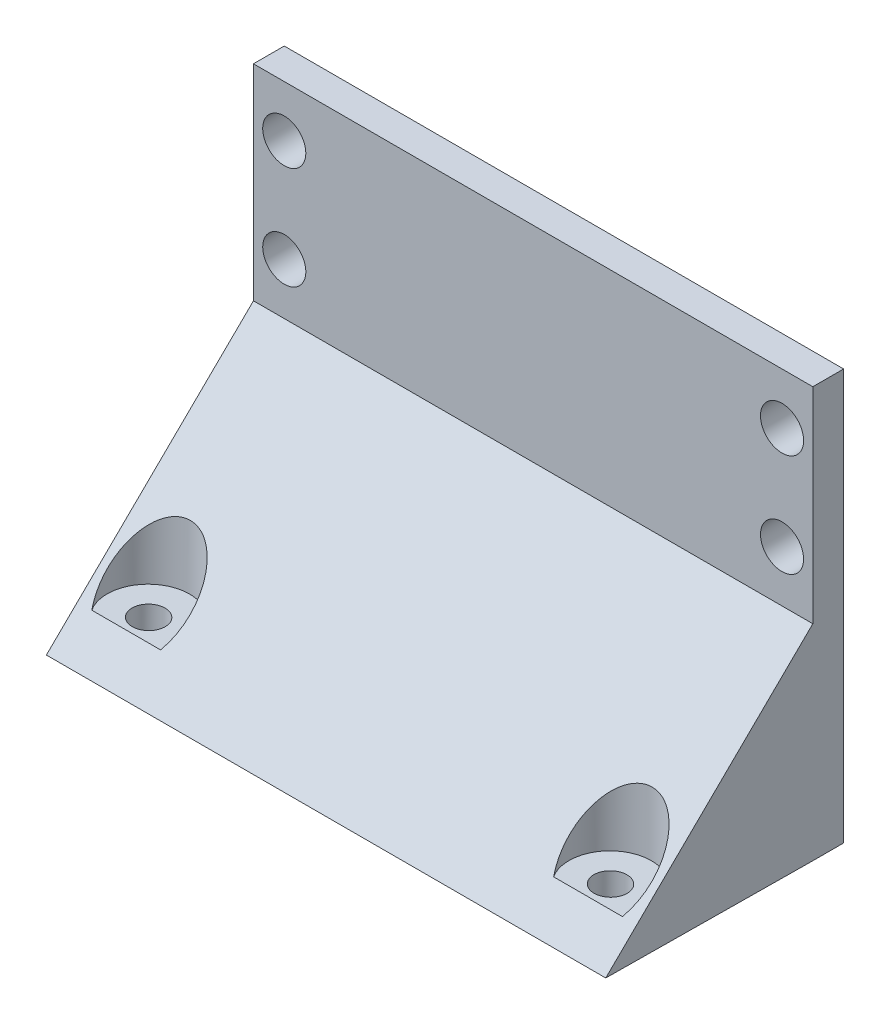
ISO-10303-21;
HEADER;
FILE_DESCRIPTION(('STEP AP214'),'2;1');
FILE_NAME('part.step','',(''),(''),'','','');
FILE_SCHEMA(('AUTOMOTIVE_DESIGN { 1 0 10303 214 1 1 1 1 }'));
ENDSEC;
DATA;
#1=APPLICATION_CONTEXT('core data for automotive mechanical design processes');
#2=APPLICATION_PROTOCOL_DEFINITION('international standard','automotive_design',2000,#1);
#3=PRODUCT_CONTEXT('',#1,'mechanical');
#4=PRODUCT('Part','Part','',(#3));
#5=PRODUCT_RELATED_PRODUCT_CATEGORY('part','',(#4));
#6=PRODUCT_DEFINITION_FORMATION('','',#4);
#7=PRODUCT_DEFINITION_CONTEXT('part definition',#1,'design');
#8=PRODUCT_DEFINITION('design','',#6,#7);
#9=PRODUCT_DEFINITION_SHAPE('','',#8);
#10=(LENGTH_UNIT() NAMED_UNIT(*) SI_UNIT(.MILLI.,.METRE.));
#11=(NAMED_UNIT(*) PLANE_ANGLE_UNIT() SI_UNIT($,.RADIAN.));
#12=(NAMED_UNIT(*) SI_UNIT($,.STERADIAN.) SOLID_ANGLE_UNIT());
#13=UNCERTAINTY_MEASURE_WITH_UNIT(LENGTH_MEASURE(1.E-05),#10,'distance_accuracy_value','');
#14=(GEOMETRIC_REPRESENTATION_CONTEXT(3) GLOBAL_UNCERTAINTY_ASSIGNED_CONTEXT((#13)) GLOBAL_UNIT_ASSIGNED_CONTEXT((#10,
#11,#12)) REPRESENTATION_CONTEXT('',''));
#15=CARTESIAN_POINT('',(0.,0.,0.));
#16=DIRECTION('',(0.,0.,1.));
#17=DIRECTION('',(1.,0.,0.));
#18=AXIS2_PLACEMENT_3D('',#15,#16,#17);
#19=CARTESIAN_POINT('',(55.6592353913338,-20.,3.));
#20=DIRECTION('',(0.,0.713679885564079,0.700471998684632));
#21=DIRECTION('',(0.,-0.700471998684632,0.713679885564079));
#22=AXIS2_PLACEMENT_3D('',#19,#20,#21);
#23=PLANE('',#22);
#24=DIRECTION('',(1.,0.,0.));
#25=VECTOR('',#24,1.);
#26=CARTESIAN_POINT('',(55.6592353913338,-36.8323579858021,20.1497438065177));
#27=LINE('',#26,#25);
#28=CARTESIAN_POINT('',(19.1504595631983,-36.8323579858021,20.1497438065177));
#29=VERTEX_POINT('',#28);
#30=CARTESIAN_POINT('',(25.8495404368017,-36.8323579858021,20.1497438065177));
#31=VERTEX_POINT('',#30);
#32=EDGE_CURVE('E121',#29,#31,#27,.T.);
#33=ORIENTED_EDGE('',*,*,#32,.F.);
#34=CARTESIAN_POINT('',(22.5,-34.6654945078744,17.9420226101467));
#35=DIRECTION('',(0.,0.713679885564079,0.700471998684632));
#36=DIRECTION('',(0.,0.700471998684632,-0.713679885564079));
#37=AXIS2_PLACEMENT_3D('',#34,#35,#36);
#38=ELLIPSE('',#37,5.65927135746234,4.);
#39=EDGE_CURVE('E54',#29,#31,#38,.F.);
#40=ORIENTED_EDGE('',*,*,#39,.T.);
#41=EDGE_LOOP('',(#33,#40));
#42=FACE_BOUND('',#41,.T.);
#43=DIRECTION('',(0.,-0.700471998684632,0.713679885564079));
#44=VECTOR('',#43,1.);
#45=CARTESIAN_POINT('',(27.25,-20.,3.));
#46=LINE('',#45,#44);
#47=CARTESIAN_POINT('',(27.25,-20.,3.));
#48=VERTEX_POINT('',#47);
#49=CARTESIAN_POINT('',(27.25,-39.8029407759475,23.1763390019155));
#50=VERTEX_POINT('',#49);
#51=EDGE_CURVE('E224',#48,#50,#46,.T.);
#52=ORIENTED_EDGE('',*,*,#51,.F.);
#53=DIRECTION('',(-1.,0.,0.));
#54=VECTOR('',#53,1.);
#55=CARTESIAN_POINT('',(55.6592353913338,-20.,3.));
#56=LINE('',#55,#54);
#57=CARTESIAN_POINT('',(-27.25,-20.,3.));
#58=VERTEX_POINT('',#57);
#59=EDGE_CURVE('E228',#48,#58,#56,.T.);
#60=ORIENTED_EDGE('',*,*,#59,.T.);
#61=DIRECTION('',(0.,0.700471998684632,-0.713679885564079));
#62=VECTOR('',#61,1.);
#63=CARTESIAN_POINT('',(-27.25,-20.,3.));
#64=LINE('',#63,#62);
#65=CARTESIAN_POINT('',(-27.25,-39.8029407759475,23.1763390019155));
#66=VERTEX_POINT('',#65);
#67=EDGE_CURVE('E229',#66,#58,#64,.T.);
#68=ORIENTED_EDGE('',*,*,#67,.F.);
#69=DIRECTION('',(-1.,0.,0.));
#70=VECTOR('',#69,1.);
#71=CARTESIAN_POINT('',(55.6592353913338,-39.8029407759475,23.1763390019155));
#72=LINE('',#71,#70);
#73=EDGE_CURVE('E225',#50,#66,#72,.T.);
#74=ORIENTED_EDGE('',*,*,#73,.F.);
#75=EDGE_LOOP('',(#52,#60,#68,#74));
#76=FACE_BOUND('',#75,.T.);
#77=DIRECTION('',(1.,0.,0.));
#78=VECTOR('',#77,1.);
#79=CARTESIAN_POINT('',(55.6592353913338,-36.8323579858021,20.1497438065177));
#80=LINE('',#79,#78);
#81=CARTESIAN_POINT('',(-25.8495404368017,-36.8323579858021,20.1497438065177));
#82=VERTEX_POINT('',#81);
#83=CARTESIAN_POINT('',(-19.1504595631983,-36.8323579858021,20.1497438065177));
#84=VERTEX_POINT('',#83);
#85=EDGE_CURVE('E145',#82,#84,#80,.T.);
#86=ORIENTED_EDGE('',*,*,#85,.F.);
#87=CARTESIAN_POINT('',(-22.5,-34.6654945078744,17.9420226101467));
#88=DIRECTION('',(0.,0.713679885564079,0.700471998684632));
#89=DIRECTION('',(0.,0.700471998684632,-0.713679885564079));
#90=AXIS2_PLACEMENT_3D('',#87,#88,#89);
#91=ELLIPSE('',#90,5.65927135746234,4.);
#92=EDGE_CURVE('E11',#82,#84,#91,.F.);
#93=ORIENTED_EDGE('',*,*,#92,.T.);
#94=EDGE_LOOP('',(#86,#93));
#95=FACE_BOUND('',#94,.T.);
#96=ADVANCED_FACE('F45',(#42,#76,#95),#23,.T.);
#97=CARTESIAN_POINT('',(0.,0.,3.));
#98=DIRECTION('',(0.,0.,1.));
#99=DIRECTION('',(1.,0.,0.));
#100=AXIS2_PLACEMENT_3D('',#97,#98,#99);
#101=PLANE('',#100);
#102=ORIENTED_EDGE('',*,*,#59,.F.);
#103=DIRECTION('',(0.,1.,0.));
#104=VECTOR('',#103,1.);
#105=CARTESIAN_POINT('',(27.25,0.,3.));
#106=LINE('',#105,#104);
#107=CARTESIAN_POINT('',(27.25,0.,3.));
#108=VERTEX_POINT('',#107);
#109=EDGE_CURVE('E164',#48,#108,#106,.T.);
#110=ORIENTED_EDGE('',*,*,#109,.T.);
#111=DIRECTION('',(-1.,0.,0.));
#112=VECTOR('',#111,1.);
#113=CARTESIAN_POINT('',(-27.25,0.,3.));
#114=LINE('',#113,#112);
#115=CARTESIAN_POINT('',(-27.25,0.,3.));
#116=VERTEX_POINT('',#115);
#117=EDGE_CURVE('E184',#108,#116,#114,.T.);
#118=ORIENTED_EDGE('',*,*,#117,.T.);
#119=DIRECTION('',(0.,-1.,0.));
#120=VECTOR('',#119,1.);
#121=CARTESIAN_POINT('',(-27.25,0.,3.));
#122=LINE('',#121,#120);
#123=EDGE_CURVE('E181',#116,#58,#122,.T.);
#124=ORIENTED_EDGE('',*,*,#123,.T.);
#125=EDGE_LOOP('',(#102,#110,#118,#124));
#126=FACE_BOUND('',#125,.T.);
#127=CARTESIAN_POINT('',(24.25,-15.,3.));
#128=DIRECTION('',(0.,0.,1.));
#129=DIRECTION('',(1.,0.,0.));
#130=AXIS2_PLACEMENT_3D('',#127,#128,#129);
#131=CIRCLE('',#130,2.1);
#132=CARTESIAN_POINT('',(26.35,-15.,3.));
#133=VERTEX_POINT('',#132);
#134=EDGE_CURVE('E201',#133,#133,#131,.T.);
#135=ORIENTED_EDGE('',*,*,#134,.F.);
#136=EDGE_LOOP('',(#135));
#137=FACE_BOUND('',#136,.T.);
#138=CARTESIAN_POINT('',(-24.25,-5.,3.));
#139=DIRECTION('',(0.,0.,1.));
#140=DIRECTION('',(1.,0.,0.));
#141=AXIS2_PLACEMENT_3D('',#138,#139,#140);
#142=CIRCLE('',#141,2.1);
#143=CARTESIAN_POINT('',(-22.15,-5.,3.));
#144=VERTEX_POINT('',#143);
#145=EDGE_CURVE('E175',#144,#144,#142,.T.);
#146=ORIENTED_EDGE('',*,*,#145,.F.);
#147=EDGE_LOOP('',(#146));
#148=FACE_BOUND('',#147,.T.);
#149=CARTESIAN_POINT('',(24.25,-4.99999999999999,3.));
#150=DIRECTION('',(0.,0.,1.));
#151=DIRECTION('',(-1.,0.,0.));
#152=AXIS2_PLACEMENT_3D('',#149,#150,#151);
#153=CIRCLE('',#152,2.1);
#154=CARTESIAN_POINT('',(22.15,-4.99999999999999,3.));
#155=VERTEX_POINT('',#154);
#156=EDGE_CURVE('E193',#155,#155,#153,.T.);
#157=ORIENTED_EDGE('',*,*,#156,.F.);
#158=EDGE_LOOP('',(#157));
#159=FACE_BOUND('',#158,.T.);
#160=CARTESIAN_POINT('',(-24.25,-15.,3.));
#161=DIRECTION('',(0.,0.,1.));
#162=DIRECTION('',(-1.,0.,0.));
#163=AXIS2_PLACEMENT_3D('',#160,#161,#162);
#164=CIRCLE('',#163,2.1);
#165=CARTESIAN_POINT('',(-26.35,-15.,3.));
#166=VERTEX_POINT('',#165);
#167=EDGE_CURVE('E209',#166,#166,#164,.T.);
#168=ORIENTED_EDGE('',*,*,#167,.F.);
#169=EDGE_LOOP('',(#168));
#170=FACE_BOUND('',#169,.T.);
#171=ADVANCED_FACE('F313',(#126,#137,#148,#159,#170),#101,.T.);
#172=CARTESIAN_POINT('',(0.,0.,0.));
#173=DIRECTION('',(0.,0.,1.));
#174=DIRECTION('',(1.,0.,0.));
#175=AXIS2_PLACEMENT_3D('',#172,#173,#174);
#176=PLANE('',#175);
#177=DIRECTION('',(0.,1.,0.));
#178=VECTOR('',#177,1.);
#179=CARTESIAN_POINT('',(27.25,0.,0.));
#180=LINE('',#179,#178);
#181=CARTESIAN_POINT('',(27.25,-40.,0.));
#182=VERTEX_POINT('',#181);
#183=CARTESIAN_POINT('',(27.25,0.,0.));
#184=VERTEX_POINT('',#183);
#185=EDGE_CURVE('E171',#182,#184,#180,.T.);
#186=ORIENTED_EDGE('',*,*,#185,.F.);
#187=DIRECTION('',(1.,0.,0.));
#188=VECTOR('',#187,1.);
#189=CARTESIAN_POINT('',(-27.25,-40.,0.));
#190=LINE('',#189,#188);
#191=CARTESIAN_POINT('',(-27.25,-40.,0.));
#192=VERTEX_POINT('',#191);
#193=EDGE_CURVE('E161',#192,#182,#190,.T.);
#194=ORIENTED_EDGE('',*,*,#193,.F.);
#195=DIRECTION('',(0.,-1.,0.));
#196=VECTOR('',#195,1.);
#197=CARTESIAN_POINT('',(-27.25,0.,0.));
#198=LINE('',#197,#196);
#199=CARTESIAN_POINT('',(-27.25,0.,0.));
#200=VERTEX_POINT('',#199);
#201=EDGE_CURVE('E165',#200,#192,#198,.T.);
#202=ORIENTED_EDGE('',*,*,#201,.F.);
#203=DIRECTION('',(-1.,0.,0.));
#204=VECTOR('',#203,1.);
#205=CARTESIAN_POINT('',(-27.25,0.,0.));
#206=LINE('',#205,#204);
#207=EDGE_CURVE('E168',#184,#200,#206,.T.);
#208=ORIENTED_EDGE('',*,*,#207,.F.);
#209=EDGE_LOOP('',(#186,#194,#202,#208));
#210=FACE_BOUND('',#209,.T.);
#211=CARTESIAN_POINT('',(-24.25,-5.,0.));
#212=DIRECTION('',(0.,0.,1.));
#213=DIRECTION('',(1.,0.,0.));
#214=AXIS2_PLACEMENT_3D('',#211,#212,#213);
#215=CIRCLE('',#214,2.1);
#216=CARTESIAN_POINT('',(-22.15,-5.,0.));
#217=VERTEX_POINT('',#216);
#218=EDGE_CURVE('E189',#217,#217,#215,.T.);
#219=ORIENTED_EDGE('',*,*,#218,.T.);
#220=EDGE_LOOP('',(#219));
#221=FACE_BOUND('',#220,.T.);
#222=CARTESIAN_POINT('',(24.25,-4.99999999999999,0.));
#223=DIRECTION('',(0.,0.,1.));
#224=DIRECTION('',(-1.,0.,0.));
#225=AXIS2_PLACEMENT_3D('',#222,#223,#224);
#226=CIRCLE('',#225,2.1);
#227=CARTESIAN_POINT('',(22.15,-4.99999999999999,0.));
#228=VERTEX_POINT('',#227);
#229=EDGE_CURVE('E197',#228,#228,#226,.T.);
#230=ORIENTED_EDGE('',*,*,#229,.T.);
#231=EDGE_LOOP('',(#230));
#232=FACE_BOUND('',#231,.T.);
#233=CARTESIAN_POINT('',(24.25,-15.,0.));
#234=DIRECTION('',(0.,0.,1.));
#235=DIRECTION('',(1.,0.,0.));
#236=AXIS2_PLACEMENT_3D('',#233,#234,#235);
#237=CIRCLE('',#236,2.1);
#238=CARTESIAN_POINT('',(26.35,-15.,0.));
#239=VERTEX_POINT('',#238);
#240=EDGE_CURVE('E205',#239,#239,#237,.T.);
#241=ORIENTED_EDGE('',*,*,#240,.T.);
#242=EDGE_LOOP('',(#241));
#243=FACE_BOUND('',#242,.T.);
#244=CARTESIAN_POINT('',(-24.25,-15.,0.));
#245=DIRECTION('',(0.,0.,1.));
#246=DIRECTION('',(-1.,0.,0.));
#247=AXIS2_PLACEMENT_3D('',#244,#245,#246);
#248=CIRCLE('',#247,2.1);
#249=CARTESIAN_POINT('',(-26.35,-15.,0.));
#250=VERTEX_POINT('',#249);
#251=EDGE_CURVE('E213',#250,#250,#248,.T.);
#252=ORIENTED_EDGE('',*,*,#251,.T.);
#253=EDGE_LOOP('',(#252));
#254=FACE_BOUND('',#253,.T.);
#255=ADVANCED_FACE('F318',(#210,#221,#232,#243,#254),#176,.F.);
#256=CARTESIAN_POINT('',(27.25,0.,3.));
#257=DIRECTION('',(-1.,0.,0.));
#258=DIRECTION('',(0.,-1.,0.));
#259=AXIS2_PLACEMENT_3D('',#256,#257,#258);
#260=PLANE('',#259);
#261=ORIENTED_EDGE('',*,*,#185,.T.);
#262=DIRECTION('',(0.,0.,-1.));
#263=VECTOR('',#262,1.);
#264=CARTESIAN_POINT('',(27.25,0.,3.));
#265=LINE('',#264,#263);
#266=EDGE_CURVE('E136',#108,#184,#265,.T.);
#267=ORIENTED_EDGE('',*,*,#266,.F.);
#268=ORIENTED_EDGE('',*,*,#109,.F.);
#269=ORIENTED_EDGE('',*,*,#51,.T.);
#270=DIRECTION('',(0.,-0.00976638159368742,-0.999952307758008));
#271=VECTOR('',#270,1.);
#272=CARTESIAN_POINT('',(27.25,-40.,3.));
#273=LINE('',#272,#271);
#274=CARTESIAN_POINT('',(27.25,-40.,3.));
#275=VERTEX_POINT('',#274);
#276=EDGE_CURVE('E217',#50,#275,#273,.T.);
#277=ORIENTED_EDGE('',*,*,#276,.T.);
#278=DIRECTION('',(0.,0.,-1.));
#279=VECTOR('',#278,1.);
#280=CARTESIAN_POINT('',(27.25,-40.,3.));
#281=LINE('',#280,#279);
#282=EDGE_CURVE('E156',#275,#182,#281,.T.);
#283=ORIENTED_EDGE('',*,*,#282,.T.);
#284=EDGE_LOOP('',(#261,#267,#268,#269,#277,#283));
#285=FACE_BOUND('',#284,.T.);
#286=ADVANCED_FACE('F47',(#285),#260,.F.);
#287=CARTESIAN_POINT('',(-27.25,0.,3.));
#288=DIRECTION('',(0.,-1.,0.));
#289=DIRECTION('',(0.,0.,-1.));
#290=AXIS2_PLACEMENT_3D('',#287,#288,#289);
#291=PLANE('',#290);
#292=ORIENTED_EDGE('',*,*,#207,.T.);
#293=DIRECTION('',(0.,0.,-1.));
#294=VECTOR('',#293,1.);
#295=CARTESIAN_POINT('',(-27.25,0.,3.));
#296=LINE('',#295,#294);
#297=EDGE_CURVE('E139',#116,#200,#296,.T.);
#298=ORIENTED_EDGE('',*,*,#297,.F.);
#299=ORIENTED_EDGE('',*,*,#117,.F.);
#300=ORIENTED_EDGE('',*,*,#266,.T.);
#301=EDGE_LOOP('',(#292,#298,#299,#300));
#302=FACE_BOUND('',#301,.T.);
#303=ADVANCED_FACE('F397',(#302),#291,.F.);
#304=CARTESIAN_POINT('',(-27.25,0.,3.));
#305=DIRECTION('',(1.,0.,0.));
#306=DIRECTION('',(0.,1.,0.));
#307=AXIS2_PLACEMENT_3D('',#304,#305,#306);
#308=PLANE('',#307);
#309=ORIENTED_EDGE('',*,*,#201,.T.);
#310=DIRECTION('',(0.,0.,-1.));
#311=VECTOR('',#310,1.);
#312=CARTESIAN_POINT('',(-27.25,-40.,3.));
#313=LINE('',#312,#311);
#314=CARTESIAN_POINT('',(-27.25,-40.,3.));
#315=VERTEX_POINT('',#314);
#316=EDGE_CURVE('E152',#315,#192,#313,.T.);
#317=ORIENTED_EDGE('',*,*,#316,.F.);
#318=DIRECTION('',(0.,0.00976638159368742,0.999952307758008));
#319=VECTOR('',#318,1.);
#320=CARTESIAN_POINT('',(-27.25,-40.,3.));
#321=LINE('',#320,#319);
#322=EDGE_CURVE('E236',#315,#66,#321,.T.);
#323=ORIENTED_EDGE('',*,*,#322,.T.);
#324=ORIENTED_EDGE('',*,*,#67,.T.);
#325=ORIENTED_EDGE('',*,*,#123,.F.);
#326=ORIENTED_EDGE('',*,*,#297,.T.);
#327=EDGE_LOOP('',(#309,#317,#323,#324,#325,#326));
#328=FACE_BOUND('',#327,.T.);
#329=ADVANCED_FACE('F390',(#328),#308,.F.);
#330=CARTESIAN_POINT('',(-27.25,-40.,3.));
#331=DIRECTION('',(0.,1.,0.));
#332=DIRECTION('',(0.,0.,1.));
#333=AXIS2_PLACEMENT_3D('',#330,#331,#332);
#334=PLANE('',#333);
#335=DIRECTION('',(1.,0.,0.));
#336=VECTOR('',#335,1.);
#337=CARTESIAN_POINT('',(-27.25,-40.,3.));
#338=LINE('',#337,#336);
#339=CARTESIAN_POINT('',(23.9999855186587,-40.,3.));
#340=VERTEX_POINT('',#339);
#341=EDGE_CURVE('E180',#340,#275,#338,.T.);
#342=ORIENTED_EDGE('',*,*,#341,.F.);
#343=CARTESIAN_POINT('',(22.5,-40.,2.99340849347453));
#344=DIRECTION('',(0.,1.,0.));
#345=DIRECTION('',(0.,0.,1.));
#346=AXIS2_PLACEMENT_3D('',#343,#344,#345);
#347=ELLIPSE('',#346,1.50007154177498,1.5);
#348=CARTESIAN_POINT('',(21.0000144813413,-40.,3.));
#349=VERTEX_POINT('',#348);
#350=EDGE_CURVE('E240',#340,#349,#347,.T.);
#351=ORIENTED_EDGE('',*,*,#350,.T.);
#352=CARTESIAN_POINT('',(-21.0000144813413,-40.,3.));
#353=VERTEX_POINT('',#352);
#354=EDGE_CURVE('E179',#353,#349,#338,.T.);
#355=ORIENTED_EDGE('',*,*,#354,.F.);
#356=CARTESIAN_POINT('',(-22.5,-40.,2.99340849347452));
#357=DIRECTION('',(0.,1.,0.));
#358=DIRECTION('',(0.,0.,1.));
#359=AXIS2_PLACEMENT_3D('',#356,#357,#358);
#360=ELLIPSE('',#359,1.50007154177498,1.5);
#361=CARTESIAN_POINT('',(-23.9999855186587,-40.,3.));
#362=VERTEX_POINT('',#361);
#363=EDGE_CURVE('E246',#353,#362,#360,.T.);
#364=ORIENTED_EDGE('',*,*,#363,.T.);
#365=EDGE_CURVE('E160',#315,#362,#338,.T.);
#366=ORIENTED_EDGE('',*,*,#365,.F.);
#367=ORIENTED_EDGE('',*,*,#316,.T.);
#368=ORIENTED_EDGE('',*,*,#193,.T.);
#369=ORIENTED_EDGE('',*,*,#282,.F.);
#370=EDGE_LOOP('',(#342,#351,#355,#364,#366,#367,#368,#369));
#371=FACE_BOUND('',#370,.T.);
#372=ADVANCED_FACE('F396',(#371),#334,.F.);
#373=CARTESIAN_POINT('',(-24.25,-5.,3.));
#374=DIRECTION('',(0.,0.,-1.));
#375=DIRECTION('',(-1.,0.,0.));
#376=AXIS2_PLACEMENT_3D('',#373,#374,#375);
#377=CYLINDRICAL_SURFACE('',#376,2.1);
#378=ORIENTED_EDGE('',*,*,#145,.T.);
#379=EDGE_LOOP('',(#378));
#380=FACE_BOUND('',#379,.T.);
#381=ORIENTED_EDGE('',*,*,#218,.F.);
#382=EDGE_LOOP('',(#381));
#383=FACE_BOUND('',#382,.T.);
#384=ADVANCED_FACE('F437',(#380,#383),#377,.F.);
#385=CARTESIAN_POINT('',(24.25,-4.99999999999999,3.));
#386=DIRECTION('',(0.,0.,-1.));
#387=DIRECTION('',(-1.,0.,0.));
#388=AXIS2_PLACEMENT_3D('',#385,#386,#387);
#389=CYLINDRICAL_SURFACE('',#388,2.1);
#390=ORIENTED_EDGE('',*,*,#156,.T.);
#391=EDGE_LOOP('',(#390));
#392=FACE_BOUND('',#391,.T.);
#393=ORIENTED_EDGE('',*,*,#229,.F.);
#394=EDGE_LOOP('',(#393));
#395=FACE_BOUND('',#394,.T.);
#396=ADVANCED_FACE('F427',(#392,#395),#389,.F.);
#397=CARTESIAN_POINT('',(24.25,-15.,3.));
#398=DIRECTION('',(0.,0.,-1.));
#399=DIRECTION('',(-1.,0.,0.));
#400=AXIS2_PLACEMENT_3D('',#397,#398,#399);
#401=CYLINDRICAL_SURFACE('',#400,2.1);
#402=ORIENTED_EDGE('',*,*,#134,.T.);
#403=EDGE_LOOP('',(#402));
#404=FACE_BOUND('',#403,.T.);
#405=ORIENTED_EDGE('',*,*,#240,.F.);
#406=EDGE_LOOP('',(#405));
#407=FACE_BOUND('',#406,.T.);
#408=ADVANCED_FACE('F306',(#404,#407),#401,.F.);
#409=CARTESIAN_POINT('',(-24.25,-15.,3.));
#410=DIRECTION('',(0.,0.,-1.));
#411=DIRECTION('',(-1.,0.,0.));
#412=AXIS2_PLACEMENT_3D('',#409,#410,#411);
#413=CYLINDRICAL_SURFACE('',#412,2.1);
#414=ORIENTED_EDGE('',*,*,#167,.T.);
#415=EDGE_LOOP('',(#414));
#416=FACE_BOUND('',#415,.T.);
#417=ORIENTED_EDGE('',*,*,#251,.F.);
#418=EDGE_LOOP('',(#417));
#419=FACE_BOUND('',#418,.T.);
#420=ADVANCED_FACE('F296',(#416,#419),#413,.F.);
#421=CARTESIAN_POINT('',(55.6592353913338,-40.,3.));
#422=DIRECTION('',(0.,-0.999952307758008,0.00976638159368742));
#423=DIRECTION('',(0.,-0.00976638159368742,-0.999952307758008));
#424=AXIS2_PLACEMENT_3D('',#421,#422,#423);
#425=PLANE('',#424);
#426=CARTESIAN_POINT('',(22.5,-40.0000643720978,2.99340912218699));
#427=DIRECTION('',(0.,-0.999952307758008,0.00976638159368742));
#428=DIRECTION('',(0.,-0.00976638159368742,-0.999952307758008));
#429=AXIS2_PLACEMENT_3D('',#426,#427,#428);
#430=CIRCLE('',#429,1.5);
#431=EDGE_CURVE('E262',#340,#349,#430,.T.);
#432=ORIENTED_EDGE('',*,*,#431,.F.);
#433=ORIENTED_EDGE('',*,*,#341,.T.);
#434=ORIENTED_EDGE('',*,*,#276,.F.);
#435=ORIENTED_EDGE('',*,*,#73,.T.);
#436=ORIENTED_EDGE('',*,*,#322,.F.);
#437=ORIENTED_EDGE('',*,*,#365,.T.);
#438=CARTESIAN_POINT('',(-22.5,-40.0000643720978,2.99340912218698));
#439=DIRECTION('',(0.,-0.999952307758008,0.00976638159368742));
#440=DIRECTION('',(0.,-0.00976638159368742,-0.999952307758008));
#441=AXIS2_PLACEMENT_3D('',#438,#439,#440);
#442=CIRCLE('',#441,1.5);
#443=EDGE_CURVE('E251',#353,#362,#442,.T.);
#444=ORIENTED_EDGE('',*,*,#443,.F.);
#445=ORIENTED_EDGE('',*,*,#354,.T.);
#446=EDGE_LOOP('',(#432,#433,#434,#435,#436,#437,#444,#445));
#447=FACE_BOUND('',#446,.T.);
#448=CARTESIAN_POINT('',(22.5,-39.8535686481925,17.9926937385571));
#449=DIRECTION('',(0.,-0.999952307758008,0.00976638159368742));
#450=DIRECTION('',(0.,-0.00976638159368742,-0.999952307758008));
#451=AXIS2_PLACEMENT_3D('',#448,#449,#450);
#452=CIRCLE('',#451,1.6);
#453=CARTESIAN_POINT('',(22.5,-39.8691948587424,16.3927700461443));
#454=VERTEX_POINT('',#453);
#455=EDGE_CURVE('E265',#454,#454,#452,.T.);
#456=ORIENTED_EDGE('',*,*,#455,.F.);
#457=EDGE_LOOP('',(#456));
#458=FACE_BOUND('',#457,.T.);
#459=CARTESIAN_POINT('',(-22.5,-39.8535686481925,17.9926937385571));
#460=DIRECTION('',(0.,-0.999952307758008,0.00976638159368742));
#461=DIRECTION('',(0.,-0.00976638159368742,-0.999952307758008));
#462=AXIS2_PLACEMENT_3D('',#459,#460,#461);
#463=CIRCLE('',#462,1.6);
#464=CARTESIAN_POINT('',(-22.5,-39.8691948587424,16.3927700461443));
#465=VERTEX_POINT('',#464);
#466=EDGE_CURVE('E254',#465,#465,#463,.T.);
#467=ORIENTED_EDGE('',*,*,#466,.F.);
#468=EDGE_LOOP('',(#467));
#469=FACE_BOUND('',#468,.T.);
#470=ADVANCED_FACE('F293',(#447,#458,#469),#425,.T.);
#471=CARTESIAN_POINT('',(-22.5,-32.0004459100338,2.91527806943748));
#472=DIRECTION('',(0.,-0.999952307758008,0.00976638159368742));
#473=DIRECTION('',(0.,-0.00976638159368742,-0.999952307758008));
#474=AXIS2_PLACEMENT_3D('',#471,#472,#473);
#475=CYLINDRICAL_SURFACE('',#474,1.5);
#476=CARTESIAN_POINT('',(-22.5,-32.0004459100338,2.91527806943748));
#477=DIRECTION('',(0.,-0.999952307758008,0.00976638159368742));
#478=DIRECTION('',(0.,-0.00976638159368742,-0.999952307758008));
#479=AXIS2_PLACEMENT_3D('',#476,#477,#478);
#480=CIRCLE('',#479,1.5);
#481=CARTESIAN_POINT('',(-22.5,-32.0150954824243,1.41534960780047));
#482=VERTEX_POINT('',#481);
#483=EDGE_CURVE('E250',#482,#482,#480,.T.);
#484=ORIENTED_EDGE('',*,*,#483,.F.);
#485=EDGE_LOOP('',(#484));
#486=FACE_BOUND('',#485,.T.);
#487=ORIENTED_EDGE('',*,*,#443,.T.);
#488=ORIENTED_EDGE('',*,*,#363,.F.);
#489=EDGE_LOOP('',(#487,#488));
#490=FACE_BOUND('',#489,.T.);
#491=ADVANCED_FACE('F295',(#486,#490),#475,.F.);
#492=CARTESIAN_POINT('',(-22.5,-32.0004459100338,2.91527806943748));
#493=DIRECTION('',(0.,-0.999952307758008,0.00976638159368742));
#494=DIRECTION('',(0.,-0.00976638159368742,-0.999952307758008));
#495=AXIS2_PLACEMENT_3D('',#492,#493,#494);
#496=PLANE('',#495);
#497=ORIENTED_EDGE('',*,*,#483,.T.);
#498=EDGE_LOOP('',(#497));
#499=FACE_BOUND('',#498,.T.);
#500=ADVANCED_FACE('F289',(#499),#496,.T.);
#501=CARTESIAN_POINT('',(-22.5,-31.8539501861285,17.9145626858076));
#502=DIRECTION('',(0.,-0.999952307758008,0.00976638159368742));
#503=DIRECTION('',(0.,-0.00976638159368742,-0.999952307758008));
#504=AXIS2_PLACEMENT_3D('',#501,#502,#503);
#505=CYLINDRICAL_SURFACE('',#504,1.6);
#506=CARTESIAN_POINT('',(-22.5,-36.8537117249185,17.963394593776));
#507=DIRECTION('',(0.,-0.999952307758008,0.00976638159368742));
#508=DIRECTION('',(0.,-0.00976638159368742,-0.999952307758008));
#509=AXIS2_PLACEMENT_3D('',#506,#507,#508);
#510=CIRCLE('',#509,1.6);
#511=CARTESIAN_POINT('',(-22.5,-36.8693379354684,16.3634709013632));
#512=VERTEX_POINT('',#511);
#513=EDGE_CURVE('E127',#512,#512,#510,.F.);
#514=ORIENTED_EDGE('',*,*,#513,.T.);
#515=EDGE_LOOP('',(#514));
#516=FACE_BOUND('',#515,.T.);
#517=ORIENTED_EDGE('',*,*,#466,.T.);
#518=EDGE_LOOP('',(#517));
#519=FACE_BOUND('',#518,.T.);
#520=ADVANCED_FACE('F285',(#516,#519),#505,.F.);
#521=CARTESIAN_POINT('',(22.5,-31.8539501861284,17.9145626858076));
#522=DIRECTION('',(0.,-0.999952307758008,0.00976638159368742));
#523=DIRECTION('',(0.,-0.00976638159368742,-0.999952307758008));
#524=AXIS2_PLACEMENT_3D('',#521,#522,#523);
#525=CYLINDRICAL_SURFACE('',#524,1.6);
#526=CARTESIAN_POINT('',(22.5,-36.8537117249185,17.9633945937761));
#527=DIRECTION('',(0.,-0.999952307758008,0.00976638159368742));
#528=DIRECTION('',(0.,-0.00976638159368742,-0.999952307758008));
#529=AXIS2_PLACEMENT_3D('',#526,#527,#528);
#530=CIRCLE('',#529,1.6);
#531=CARTESIAN_POINT('',(22.5,-36.8693379354684,16.3634709013632));
#532=VERTEX_POINT('',#531);
#533=EDGE_CURVE('E128',#532,#532,#530,.F.);
#534=ORIENTED_EDGE('',*,*,#533,.T.);
#535=EDGE_LOOP('',(#534));
#536=FACE_BOUND('',#535,.T.);
#537=ORIENTED_EDGE('',*,*,#455,.T.);
#538=EDGE_LOOP('',(#537));
#539=FACE_BOUND('',#538,.T.);
#540=ADVANCED_FACE('F288',(#536,#539),#525,.F.);
#541=CARTESIAN_POINT('',(22.5,-32.0004459100338,2.91527806943749));
#542=DIRECTION('',(0.,-0.999952307758008,0.00976638159368742));
#543=DIRECTION('',(0.,-0.00976638159368742,-0.999952307758008));
#544=AXIS2_PLACEMENT_3D('',#541,#542,#543);
#545=CYLINDRICAL_SURFACE('',#544,1.5);
#546=CARTESIAN_POINT('',(22.5,-32.0004459100338,2.91527806943749));
#547=DIRECTION('',(0.,-0.999952307758008,0.00976638159368742));
#548=DIRECTION('',(0.,-0.00976638159368742,-0.999952307758008));
#549=AXIS2_PLACEMENT_3D('',#546,#547,#548);
#550=CIRCLE('',#549,1.5);
#551=CARTESIAN_POINT('',(22.5,-32.0150954824243,1.41534960780047));
#552=VERTEX_POINT('',#551);
#553=EDGE_CURVE('E258',#552,#552,#550,.T.);
#554=ORIENTED_EDGE('',*,*,#553,.F.);
#555=EDGE_LOOP('',(#554));
#556=FACE_BOUND('',#555,.T.);
#557=ORIENTED_EDGE('',*,*,#431,.T.);
#558=ORIENTED_EDGE('',*,*,#350,.F.);
#559=EDGE_LOOP('',(#557,#558));
#560=FACE_BOUND('',#559,.T.);
#561=ADVANCED_FACE('F327',(#556,#560),#545,.F.);
#562=CARTESIAN_POINT('',(22.5,-32.0004459100338,2.91527806943749));
#563=DIRECTION('',(0.,-0.999952307758008,0.00976638159368742));
#564=DIRECTION('',(0.,-0.00976638159368742,-0.999952307758008));
#565=AXIS2_PLACEMENT_3D('',#562,#563,#564);
#566=PLANE('',#565);
#567=ORIENTED_EDGE('',*,*,#553,.T.);
#568=EDGE_LOOP('',(#567));
#569=FACE_BOUND('',#568,.T.);
#570=ADVANCED_FACE('F325',(#569),#566,.T.);
#571=CARTESIAN_POINT('',(22.5,-36.8537117249185,17.9633945937761));
#572=DIRECTION('',(0.,-0.999952307758008,0.00976638159368742));
#573=DIRECTION('',(0.,-0.00976638159368742,-0.999952307758008));
#574=AXIS2_PLACEMENT_3D('',#571,#572,#573);
#575=PLANE('',#574);
#576=ORIENTED_EDGE('',*,*,#32,.T.);
#577=CARTESIAN_POINT('',(22.5,-36.8537117249185,17.9633945937761));
#578=DIRECTION('',(0.,-0.999952307758008,0.00976638159368742));
#579=DIRECTION('',(0.,-0.00976638159368742,-0.999952307758008));
#580=AXIS2_PLACEMENT_3D('',#577,#578,#579);
#581=CIRCLE('',#580,4.);
#582=EDGE_CURVE('E67',#29,#31,#581,.T.);
#583=ORIENTED_EDGE('',*,*,#582,.F.);
#584=EDGE_LOOP('',(#576,#583));
#585=FACE_BOUND('',#584,.T.);
#586=ORIENTED_EDGE('',*,*,#533,.F.);
#587=EDGE_LOOP('',(#586));
#588=FACE_BOUND('',#587,.T.);
#589=ADVANCED_FACE('F122',(#585,#588),#575,.F.);
#590=CARTESIAN_POINT('',(22.5,-36.8537117249185,17.9633945937761));
#591=DIRECTION('',(0.,0.999952307758008,-0.00976638159368742));
#592=DIRECTION('',(0.,0.00976638159368742,0.999952307758008));
#593=AXIS2_PLACEMENT_3D('',#590,#591,#592);
#594=CYLINDRICAL_SURFACE('',#593,4.);
#595=ORIENTED_EDGE('',*,*,#582,.T.);
#596=ORIENTED_EDGE('',*,*,#39,.F.);
#597=EDGE_LOOP('',(#595,#596));
#598=FACE_BOUND('',#597,.T.);
#599=ADVANCED_FACE('F131',(#598),#594,.F.);
#600=CARTESIAN_POINT('',(-22.5,-36.8537117249185,17.963394593776));
#601=DIRECTION('',(0.,-0.999952307758008,0.00976638159368742));
#602=DIRECTION('',(0.,-0.00976638159368742,-0.999952307758008));
#603=AXIS2_PLACEMENT_3D('',#600,#601,#602);
#604=PLANE('',#603);
#605=ORIENTED_EDGE('',*,*,#85,.T.);
#606=CARTESIAN_POINT('',(-22.5,-36.8537117249185,17.963394593776));
#607=DIRECTION('',(0.,-0.999952307758008,0.00976638159368742));
#608=DIRECTION('',(0.,-0.00976638159368742,-0.999952307758008));
#609=AXIS2_PLACEMENT_3D('',#606,#607,#608);
#610=CIRCLE('',#609,4.);
#611=EDGE_CURVE('E60',#82,#84,#610,.T.);
#612=ORIENTED_EDGE('',*,*,#611,.F.);
#613=EDGE_LOOP('',(#605,#612));
#614=FACE_BOUND('',#613,.T.);
#615=ORIENTED_EDGE('',*,*,#513,.F.);
#616=EDGE_LOOP('',(#615));
#617=FACE_BOUND('',#616,.T.);
#618=ADVANCED_FACE('F279',(#614,#617),#604,.F.);
#619=CARTESIAN_POINT('',(-22.5,-36.8537117249185,17.963394593776));
#620=DIRECTION('',(0.,0.999952307758008,-0.00976638159368742));
#621=DIRECTION('',(0.,0.00976638159368742,0.999952307758008));
#622=AXIS2_PLACEMENT_3D('',#619,#620,#621);
#623=CYLINDRICAL_SURFACE('',#622,4.);
#624=ORIENTED_EDGE('',*,*,#611,.T.);
#625=ORIENTED_EDGE('',*,*,#92,.F.);
#626=EDGE_LOOP('',(#624,#625));
#627=FACE_BOUND('',#626,.T.);
#628=ADVANCED_FACE('F276',(#627),#623,.F.);
#629=CLOSED_SHELL('',(#96,#171,#255,#286,#303,#329,#372,#384,#396,#408,#420,#470,#491,#500,#520,
#540,#561,#570,#589,#599,#618,#628));
#630=MANIFOLD_SOLID_BREP('B2',#629);
#631=ADVANCED_BREP_SHAPE_REPRESENTATION('',(#18,#630),#14);
#632=SHAPE_DEFINITION_REPRESENTATION(#9,#631);
ENDSEC;
END-ISO-10303-21;
